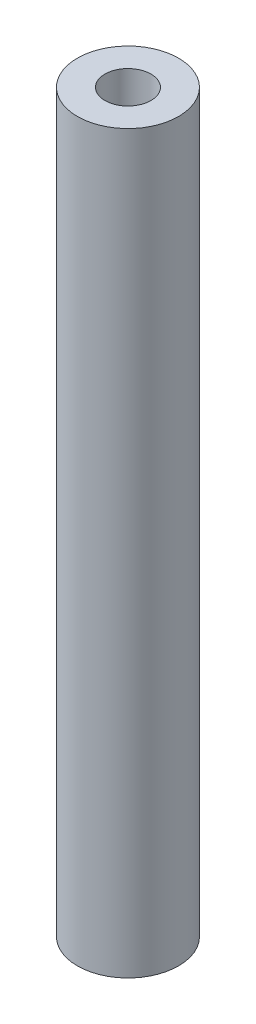
ISO-10303-21;
HEADER;
FILE_DESCRIPTION(('STEP AP214'),'2;1');
FILE_NAME('part.step','',(''),(''),'','','');
FILE_SCHEMA(('AUTOMOTIVE_DESIGN { 1 0 10303 214 1 1 1 1 }'));
ENDSEC;
DATA;
#1=APPLICATION_CONTEXT('core data for automotive mechanical design processes');
#2=APPLICATION_PROTOCOL_DEFINITION('international standard','automotive_design',2000,#1);
#3=PRODUCT_CONTEXT('',#1,'mechanical');
#4=PRODUCT('Part','Part','',(#3));
#5=PRODUCT_RELATED_PRODUCT_CATEGORY('part','',(#4));
#6=PRODUCT_DEFINITION_FORMATION('','',#4);
#7=PRODUCT_DEFINITION_CONTEXT('part definition',#1,'design');
#8=PRODUCT_DEFINITION('design','',#6,#7);
#9=PRODUCT_DEFINITION_SHAPE('','',#8);
#10=(LENGTH_UNIT() NAMED_UNIT(*) SI_UNIT(.MILLI.,.METRE.));
#11=(NAMED_UNIT(*) PLANE_ANGLE_UNIT() SI_UNIT($,.RADIAN.));
#12=(NAMED_UNIT(*) SI_UNIT($,.STERADIAN.) SOLID_ANGLE_UNIT());
#13=UNCERTAINTY_MEASURE_WITH_UNIT(LENGTH_MEASURE(1.E-05),#10,'distance_accuracy_value','');
#14=(GEOMETRIC_REPRESENTATION_CONTEXT(3) GLOBAL_UNCERTAINTY_ASSIGNED_CONTEXT((#13)) GLOBAL_UNIT_ASSIGNED_CONTEXT((#10,
#11,#12)) REPRESENTATION_CONTEXT('',''));
#15=CARTESIAN_POINT('',(0.,0.,0.));
#16=DIRECTION('',(0.,0.,1.));
#17=DIRECTION('',(1.,0.,0.));
#18=AXIS2_PLACEMENT_3D('',#15,#16,#17);
#19=CARTESIAN_POINT('',(0.,40.,0.));
#20=DIRECTION('',(0.,1.,0.));
#21=DIRECTION('',(0.,0.,1.));
#22=AXIS2_PLACEMENT_3D('',#19,#20,#21);
#23=PLANE('',#22);
#24=CARTESIAN_POINT('',(0.,40.,0.));
#25=DIRECTION('',(0.,1.,0.));
#26=DIRECTION('',(0.,0.,1.));
#27=AXIS2_PLACEMENT_3D('',#24,#25,#26);
#28=CIRCLE('',#27,2.75);
#29=CARTESIAN_POINT('',(0.,40.,2.75));
#30=VERTEX_POINT('',#29);
#31=EDGE_CURVE('E10',#30,#30,#28,.T.);
#32=ORIENTED_EDGE('',*,*,#31,.T.);
#33=EDGE_LOOP('',(#32));
#34=FACE_BOUND('',#33,.T.);
#35=CARTESIAN_POINT('',(0.,40.,0.));
#36=DIRECTION('',(0.,1.,0.));
#37=DIRECTION('',(0.,0.,1.));
#38=AXIS2_PLACEMENT_3D('',#35,#36,#37);
#39=CIRCLE('',#38,1.25);
#40=CARTESIAN_POINT('',(0.,40.,1.25));
#41=VERTEX_POINT('',#40);
#42=EDGE_CURVE('E50',#41,#41,#39,.T.);
#43=ORIENTED_EDGE('',*,*,#42,.F.);
#44=EDGE_LOOP('',(#43));
#45=FACE_BOUND('',#44,.T.);
#46=ADVANCED_FACE('F39',(#34,#45),#23,.T.);
#47=CARTESIAN_POINT('',(0.,0.,0.));
#48=DIRECTION('',(0.,1.,0.));
#49=DIRECTION('',(0.,0.,1.));
#50=AXIS2_PLACEMENT_3D('',#47,#48,#49);
#51=PLANE('',#50);
#52=CARTESIAN_POINT('',(0.,0.,0.));
#53=DIRECTION('',(0.,1.,0.));
#54=DIRECTION('',(0.,0.,1.));
#55=AXIS2_PLACEMENT_3D('',#52,#53,#54);
#56=CIRCLE('',#55,2.75);
#57=CARTESIAN_POINT('',(0.,0.,2.75));
#58=VERTEX_POINT('',#57);
#59=EDGE_CURVE('E43',#58,#58,#56,.T.);
#60=ORIENTED_EDGE('',*,*,#59,.F.);
#61=EDGE_LOOP('',(#60));
#62=FACE_BOUND('',#61,.T.);
#63=CARTESIAN_POINT('',(0.,0.,0.));
#64=DIRECTION('',(0.,1.,0.));
#65=DIRECTION('',(0.,0.,1.));
#66=AXIS2_PLACEMENT_3D('',#63,#64,#65);
#67=CIRCLE('',#66,1.25);
#68=CARTESIAN_POINT('',(0.,0.,1.25));
#69=VERTEX_POINT('',#68);
#70=EDGE_CURVE('E52',#69,#69,#67,.T.);
#71=ORIENTED_EDGE('',*,*,#70,.T.);
#72=EDGE_LOOP('',(#71));
#73=FACE_BOUND('',#72,.T.);
#74=ADVANCED_FACE('F62',(#62,#73),#51,.F.);
#75=CARTESIAN_POINT('',(0.,40.,0.));
#76=DIRECTION('',(0.,-1.,0.));
#77=DIRECTION('',(0.,0.,-1.));
#78=AXIS2_PLACEMENT_3D('',#75,#76,#77);
#79=CYLINDRICAL_SURFACE('',#78,2.75);
#80=ORIENTED_EDGE('',*,*,#31,.F.);
#81=EDGE_LOOP('',(#80));
#82=FACE_BOUND('',#81,.T.);
#83=ORIENTED_EDGE('',*,*,#59,.T.);
#84=EDGE_LOOP('',(#83));
#85=FACE_BOUND('',#84,.T.);
#86=ADVANCED_FACE('F41',(#82,#85),#79,.T.);
#87=CARTESIAN_POINT('',(0.,40.,0.));
#88=DIRECTION('',(0.,-1.,0.));
#89=DIRECTION('',(0.,0.,-1.));
#90=AXIS2_PLACEMENT_3D('',#87,#88,#89);
#91=CYLINDRICAL_SURFACE('',#90,1.25);
#92=ORIENTED_EDGE('',*,*,#42,.T.);
#93=EDGE_LOOP('',(#92));
#94=FACE_BOUND('',#93,.T.);
#95=ORIENTED_EDGE('',*,*,#70,.F.);
#96=EDGE_LOOP('',(#95));
#97=FACE_BOUND('',#96,.T.);
#98=ADVANCED_FACE('F58',(#94,#97),#91,.F.);
#99=CLOSED_SHELL('',(#46,#74,#86,#98));
#100=MANIFOLD_SOLID_BREP('B2',#99);
#101=ADVANCED_BREP_SHAPE_REPRESENTATION('',(#18,#100),#14);
#102=SHAPE_DEFINITION_REPRESENTATION(#9,#101);
ENDSEC;
END-ISO-10303-21;
